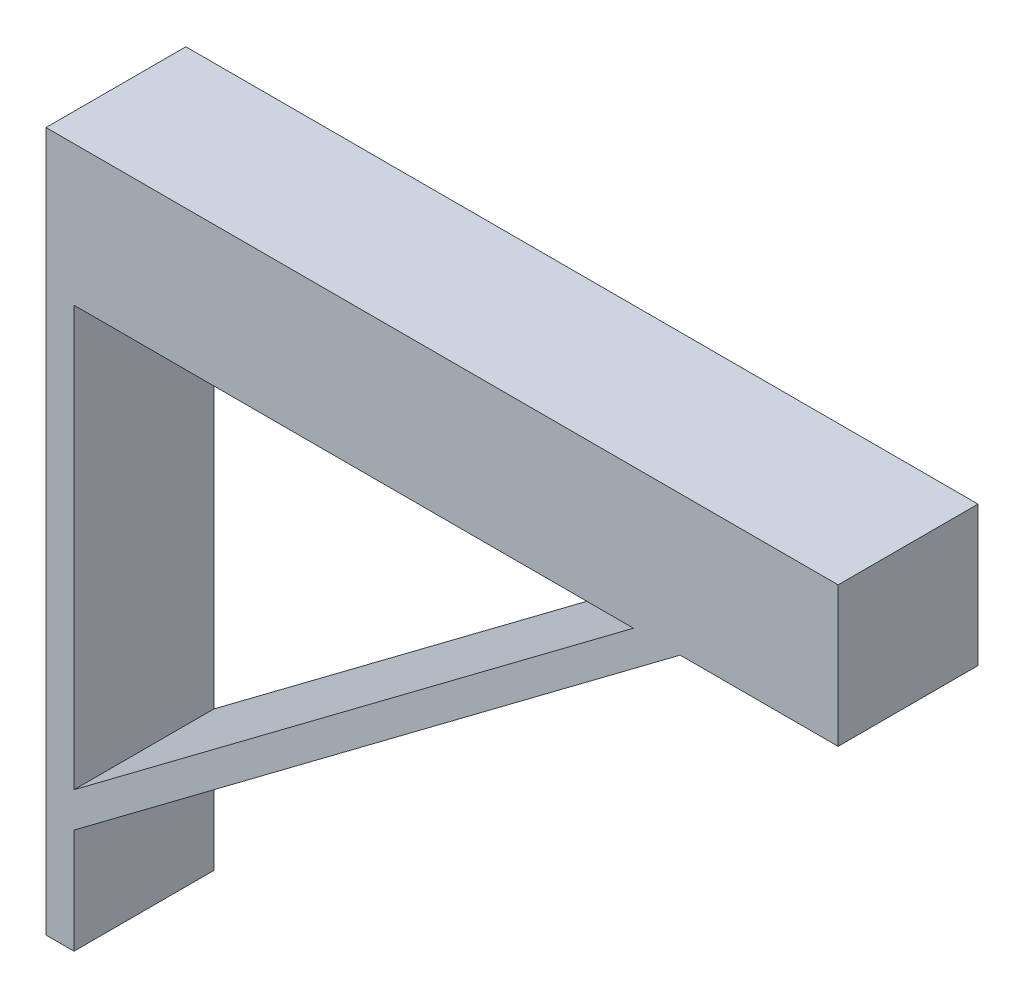
ISO-10303-21;
HEADER;
FILE_DESCRIPTION(('STEP AP214'),'2;1');
FILE_NAME('part.step','',(''),(''),'','','');
FILE_SCHEMA(('AUTOMOTIVE_DESIGN { 1 0 10303 214 1 1 1 1 }'));
ENDSEC;
DATA;
#1=APPLICATION_CONTEXT('core data for automotive mechanical design processes');
#2=APPLICATION_PROTOCOL_DEFINITION('international standard','automotive_design',2000,#1);
#3=PRODUCT_CONTEXT('',#1,'mechanical');
#4=PRODUCT('Part','Part','',(#3));
#5=PRODUCT_RELATED_PRODUCT_CATEGORY('part','',(#4));
#6=PRODUCT_DEFINITION_FORMATION('','',#4);
#7=PRODUCT_DEFINITION_CONTEXT('part definition',#1,'design');
#8=PRODUCT_DEFINITION('design','',#6,#7);
#9=PRODUCT_DEFINITION_SHAPE('','',#8);
#10=(LENGTH_UNIT() NAMED_UNIT(*) SI_UNIT(.MILLI.,.METRE.));
#11=(NAMED_UNIT(*) PLANE_ANGLE_UNIT() SI_UNIT($,.RADIAN.));
#12=(NAMED_UNIT(*) SI_UNIT($,.STERADIAN.) SOLID_ANGLE_UNIT());
#13=UNCERTAINTY_MEASURE_WITH_UNIT(LENGTH_MEASURE(1.E-05),#10,'distance_accuracy_value','');
#14=(GEOMETRIC_REPRESENTATION_CONTEXT(3) GLOBAL_UNCERTAINTY_ASSIGNED_CONTEXT((#13)) GLOBAL_UNIT_ASSIGNED_CONTEXT((#10,
#11,#12)) REPRESENTATION_CONTEXT('',''));
#15=CARTESIAN_POINT('',(0.,0.,0.));
#16=DIRECTION('',(0.,0.,1.));
#17=DIRECTION('',(1.,0.,0.));
#18=AXIS2_PLACEMENT_3D('',#15,#16,#17);
#19=CARTESIAN_POINT('',(8.88791208791208,-11.8505494505494,20.));
#20=DIRECTION('',(0.6,-0.8,0.));
#21=DIRECTION('',(0.8,0.6,0.));
#22=AXIS2_PLACEMENT_3D('',#19,#20,#21);
#23=PLANE('',#22);
#24=DIRECTION('',(-0.8,-0.6,0.));
#25=VECTOR('',#24,1.);
#26=CARTESIAN_POINT('',(8.88791208791208,-11.8505494505494,0.));
#27=LINE('',#26,#25);
#28=CARTESIAN_POINT('',(42.7106227106227,13.5164835164835,0.));
#29=VERTEX_POINT('',#28);
#30=CARTESIAN_POINT('',(-43.956043956044,-51.4835164835165,0.));
#31=VERTEX_POINT('',#30);
#32=EDGE_CURVE('E177',#29,#31,#27,.T.);
#33=ORIENTED_EDGE('',*,*,#32,.F.);
#34=DIRECTION('',(0.,0.,-1.));
#35=VECTOR('',#34,1.);
#36=CARTESIAN_POINT('',(42.7106227106227,13.5164835164835,20.));
#37=LINE('',#36,#35);
#38=CARTESIAN_POINT('',(42.7106227106227,13.5164835164835,20.));
#39=VERTEX_POINT('',#38);
#40=EDGE_CURVE('E11',#39,#29,#37,.T.);
#41=ORIENTED_EDGE('',*,*,#40,.F.);
#42=DIRECTION('',(-0.8,-0.6,0.));
#43=VECTOR('',#42,1.);
#44=CARTESIAN_POINT('',(8.88791208791208,-11.8505494505494,20.));
#45=LINE('',#44,#43);
#46=CARTESIAN_POINT('',(-43.956043956044,-51.4835164835165,20.));
#47=VERTEX_POINT('',#46);
#48=EDGE_CURVE('E194',#39,#47,#45,.T.);
#49=ORIENTED_EDGE('',*,*,#48,.T.);
#50=DIRECTION('',(0.,0.,-1.));
#51=VECTOR('',#50,1.);
#52=CARTESIAN_POINT('',(-43.956043956044,-51.4835164835165,20.));
#53=LINE('',#52,#51);
#54=EDGE_CURVE('E54',#47,#31,#53,.T.);
#55=ORIENTED_EDGE('',*,*,#54,.T.);
#56=EDGE_LOOP('',(#33,#41,#49,#55));
#57=FACE_BOUND('',#56,.T.);
#58=ADVANCED_FACE('F35',(#57),#23,.T.);
#59=CARTESIAN_POINT('',(0.,13.5164835164835,20.));
#60=DIRECTION('',(0.,1.,0.));
#61=DIRECTION('',(-1.,0.,0.));
#62=AXIS2_PLACEMENT_3D('',#59,#60,#61);
#63=PLANE('',#62);
#64=DIRECTION('',(1.,0.,0.));
#65=VECTOR('',#64,1.);
#66=CARTESIAN_POINT('',(0.,13.5164835164835,0.));
#67=LINE('',#66,#65);
#68=CARTESIAN_POINT('',(65.3039560439561,13.5164835164835,0.));
#69=VERTEX_POINT('',#68);
#70=EDGE_CURVE('E174',#29,#69,#67,.T.);
#71=ORIENTED_EDGE('',*,*,#70,.T.);
#72=DIRECTION('',(0.,0.,-1.));
#73=VECTOR('',#72,1.);
#74=CARTESIAN_POINT('',(65.3039560439561,13.5164835164835,20.));
#75=LINE('',#74,#73);
#76=CARTESIAN_POINT('',(65.3039560439561,13.5164835164835,20.));
#77=VERTEX_POINT('',#76);
#78=EDGE_CURVE('E45',#77,#69,#75,.T.);
#79=ORIENTED_EDGE('',*,*,#78,.F.);
#80=DIRECTION('',(1.,0.,0.));
#81=VECTOR('',#80,1.);
#82=CARTESIAN_POINT('',(0.,13.5164835164835,20.));
#83=LINE('',#82,#81);
#84=EDGE_CURVE('E192',#39,#77,#83,.T.);
#85=ORIENTED_EDGE('',*,*,#84,.F.);
#86=ORIENTED_EDGE('',*,*,#40,.T.);
#87=EDGE_LOOP('',(#71,#79,#85,#86));
#88=FACE_BOUND('',#87,.T.);
#89=ADVANCED_FACE('F216',(#88),#63,.F.);
#90=CARTESIAN_POINT('',(65.3039560439561,0.,20.));
#91=DIRECTION('',(1.,0.,0.));
#92=DIRECTION('',(0.,1.,0.));
#93=AXIS2_PLACEMENT_3D('',#90,#91,#92);
#94=PLANE('',#93);
#95=DIRECTION('',(0.,-1.,0.));
#96=VECTOR('',#95,1.);
#97=CARTESIAN_POINT('',(65.3039560439561,0.,0.));
#98=LINE('',#97,#96);
#99=CARTESIAN_POINT('',(65.303956043956,33.5164835164835,0.));
#100=VERTEX_POINT('',#99);
#101=EDGE_CURVE('E171',#100,#69,#98,.T.);
#102=ORIENTED_EDGE('',*,*,#101,.F.);
#103=DIRECTION('',(0.,0.,-1.));
#104=VECTOR('',#103,1.);
#105=CARTESIAN_POINT('',(65.303956043956,33.5164835164835,20.));
#106=LINE('',#105,#104);
#107=CARTESIAN_POINT('',(65.303956043956,33.5164835164835,20.));
#108=VERTEX_POINT('',#107);
#109=EDGE_CURVE('E144',#108,#100,#106,.T.);
#110=ORIENTED_EDGE('',*,*,#109,.F.);
#111=DIRECTION('',(0.,-1.,0.));
#112=VECTOR('',#111,1.);
#113=CARTESIAN_POINT('',(65.3039560439561,0.,20.));
#114=LINE('',#113,#112);
#115=EDGE_CURVE('E189',#108,#77,#114,.T.);
#116=ORIENTED_EDGE('',*,*,#115,.T.);
#117=ORIENTED_EDGE('',*,*,#78,.T.);
#118=EDGE_LOOP('',(#102,#110,#116,#117));
#119=FACE_BOUND('',#118,.T.);
#120=ADVANCED_FACE('F221',(#119),#94,.T.);
#121=CARTESIAN_POINT('',(0.,33.5164835164835,20.));
#122=DIRECTION('',(0.,1.,0.));
#123=DIRECTION('',(0.,0.,1.));
#124=AXIS2_PLACEMENT_3D('',#121,#122,#123);
#125=PLANE('',#124);
#126=DIRECTION('',(1.,0.,0.));
#127=VECTOR('',#126,1.);
#128=CARTESIAN_POINT('',(0.,33.5164835164835,0.));
#129=LINE('',#128,#127);
#130=CARTESIAN_POINT('',(-47.956043956044,33.5164835164835,0.));
#131=VERTEX_POINT('',#130);
#132=EDGE_CURVE('E168',#131,#100,#129,.T.);
#133=ORIENTED_EDGE('',*,*,#132,.F.);
#134=DIRECTION('',(0.,0.,-1.));
#135=VECTOR('',#134,1.);
#136=CARTESIAN_POINT('',(-47.956043956044,33.5164835164835,20.));
#137=LINE('',#136,#135);
#138=CARTESIAN_POINT('',(-47.956043956044,33.5164835164835,20.));
#139=VERTEX_POINT('',#138);
#140=EDGE_CURVE('E142',#139,#131,#137,.T.);
#141=ORIENTED_EDGE('',*,*,#140,.F.);
#142=DIRECTION('',(1.,0.,0.));
#143=VECTOR('',#142,1.);
#144=CARTESIAN_POINT('',(0.,33.5164835164835,20.));
#145=LINE('',#144,#143);
#146=EDGE_CURVE('E136',#139,#108,#145,.T.);
#147=ORIENTED_EDGE('',*,*,#146,.T.);
#148=ORIENTED_EDGE('',*,*,#109,.T.);
#149=EDGE_LOOP('',(#133,#141,#147,#148));
#150=FACE_BOUND('',#149,.T.);
#151=ADVANCED_FACE('F227',(#150),#125,.T.);
#152=CARTESIAN_POINT('',(-47.956043956044,0.,20.));
#153=DIRECTION('',(1.,0.,0.));
#154=DIRECTION('',(0.,1.,0.));
#155=AXIS2_PLACEMENT_3D('',#152,#153,#154);
#156=PLANE('',#155);
#157=DIRECTION('',(0.,-1.,0.));
#158=VECTOR('',#157,1.);
#159=CARTESIAN_POINT('',(-47.956043956044,0.,0.));
#160=LINE('',#159,#158);
#161=CARTESIAN_POINT('',(-47.956043956044,-66.4835164835165,0.));
#162=VERTEX_POINT('',#161);
#163=EDGE_CURVE('E141',#131,#162,#160,.T.);
#164=ORIENTED_EDGE('',*,*,#163,.T.);
#165=DIRECTION('',(0.,0.,-1.));
#166=VECTOR('',#165,1.);
#167=CARTESIAN_POINT('',(-47.956043956044,-66.4835164835165,20.));
#168=LINE('',#167,#166);
#169=CARTESIAN_POINT('',(-47.956043956044,-66.4835164835165,20.));
#170=VERTEX_POINT('',#169);
#171=EDGE_CURVE('E123',#170,#162,#168,.T.);
#172=ORIENTED_EDGE('',*,*,#171,.F.);
#173=DIRECTION('',(0.,-1.,0.));
#174=VECTOR('',#173,1.);
#175=CARTESIAN_POINT('',(-47.956043956044,0.,20.));
#176=LINE('',#175,#174);
#177=EDGE_CURVE('E128',#139,#170,#176,.T.);
#178=ORIENTED_EDGE('',*,*,#177,.F.);
#179=ORIENTED_EDGE('',*,*,#140,.T.);
#180=EDGE_LOOP('',(#164,#172,#178,#179));
#181=FACE_BOUND('',#180,.T.);
#182=ADVANCED_FACE('F139',(#181),#156,.F.);
#183=CARTESIAN_POINT('',(-2.30661033618894E-13,-66.4835164835167,20.));
#184=DIRECTION('',(0.,1.,0.));
#185=DIRECTION('',(-1.,0.,0.));
#186=AXIS2_PLACEMENT_3D('',#183,#184,#185);
#187=PLANE('',#186);
#188=DIRECTION('',(1.,0.,0.));
#189=VECTOR('',#188,1.);
#190=CARTESIAN_POINT('',(-2.30661033618894E-13,-66.4835164835167,0.));
#191=LINE('',#190,#189);
#192=CARTESIAN_POINT('',(-43.956043956044,-66.4835164835165,0.));
#193=VERTEX_POINT('',#192);
#194=EDGE_CURVE('E165',#162,#193,#191,.T.);
#195=ORIENTED_EDGE('',*,*,#194,.T.);
#196=DIRECTION('',(0.,0.,-1.));
#197=VECTOR('',#196,1.);
#198=CARTESIAN_POINT('',(-43.956043956044,-66.4835164835165,20.));
#199=LINE('',#198,#197);
#200=CARTESIAN_POINT('',(-43.956043956044,-66.4835164835165,20.));
#201=VERTEX_POINT('',#200);
#202=EDGE_CURVE('E86',#201,#193,#199,.T.);
#203=ORIENTED_EDGE('',*,*,#202,.F.);
#204=DIRECTION('',(1.,0.,0.));
#205=VECTOR('',#204,1.);
#206=CARTESIAN_POINT('',(-2.30661033618894E-13,-66.4835164835167,20.));
#207=LINE('',#206,#205);
#208=EDGE_CURVE('E119',#170,#201,#207,.T.);
#209=ORIENTED_EDGE('',*,*,#208,.F.);
#210=ORIENTED_EDGE('',*,*,#171,.T.);
#211=EDGE_LOOP('',(#195,#203,#209,#210));
#212=FACE_BOUND('',#211,.T.);
#213=ADVANCED_FACE('F121',(#212),#187,.F.);
#214=CARTESIAN_POINT('',(-43.956043956044,0.,20.));
#215=DIRECTION('',(1.,0.,0.));
#216=DIRECTION('',(0.,0.,-1.));
#217=AXIS2_PLACEMENT_3D('',#214,#215,#216);
#218=PLANE('',#217);
#219=DIRECTION('',(0.,-1.,0.));
#220=VECTOR('',#219,1.);
#221=CARTESIAN_POINT('',(-43.956043956044,0.,0.));
#222=LINE('',#221,#220);
#223=CARTESIAN_POINT('',(-43.956043956044,13.5164835164835,0.));
#224=VERTEX_POINT('',#223);
#225=CARTESIAN_POINT('',(-43.956043956044,-46.4835164835165,0.));
#226=VERTEX_POINT('',#225);
#227=EDGE_CURVE('E184',#224,#226,#222,.T.);
#228=ORIENTED_EDGE('',*,*,#227,.F.);
#229=DIRECTION('',(0.,0.,-1.));
#230=VECTOR('',#229,1.);
#231=CARTESIAN_POINT('',(-43.956043956044,13.5164835164835,20.));
#232=LINE('',#231,#230);
#233=CARTESIAN_POINT('',(-43.956043956044,13.5164835164835,20.));
#234=VERTEX_POINT('',#233);
#235=EDGE_CURVE('E39',#234,#224,#232,.T.);
#236=ORIENTED_EDGE('',*,*,#235,.F.);
#237=DIRECTION('',(0.,-1.,0.));
#238=VECTOR('',#237,1.);
#239=CARTESIAN_POINT('',(-43.956043956044,0.,20.));
#240=LINE('',#239,#238);
#241=CARTESIAN_POINT('',(-43.956043956044,-46.4835164835165,20.));
#242=VERTEX_POINT('',#241);
#243=EDGE_CURVE('E164',#234,#242,#240,.T.);
#244=ORIENTED_EDGE('',*,*,#243,.T.);
#245=DIRECTION('',(0.,0.,-1.));
#246=VECTOR('',#245,1.);
#247=CARTESIAN_POINT('',(-43.956043956044,-46.4835164835165,20.));
#248=LINE('',#247,#246);
#249=EDGE_CURVE('E151',#242,#226,#248,.T.);
#250=ORIENTED_EDGE('',*,*,#249,.T.);
#251=EDGE_LOOP('',(#228,#236,#244,#250));
#252=FACE_BOUND('',#251,.T.);
#253=ADVANCED_FACE('F37',(#252),#218,.T.);
#254=CARTESIAN_POINT('',(0.,13.5164835164835,20.));
#255=DIRECTION('',(0.,1.,0.));
#256=DIRECTION('',(0.,0.,1.));
#257=AXIS2_PLACEMENT_3D('',#254,#255,#256);
#258=PLANE('',#257);
#259=DIRECTION('',(1.,0.,0.));
#260=VECTOR('',#259,1.);
#261=CARTESIAN_POINT('',(0.,13.5164835164835,0.));
#262=LINE('',#261,#260);
#263=CARTESIAN_POINT('',(36.043956043956,13.5164835164835,0.));
#264=VERTEX_POINT('',#263);
#265=EDGE_CURVE('E182',#224,#264,#262,.T.);
#266=ORIENTED_EDGE('',*,*,#265,.T.);
#267=DIRECTION('',(0.,0.,-1.));
#268=VECTOR('',#267,1.);
#269=CARTESIAN_POINT('',(36.043956043956,13.5164835164835,20.));
#270=LINE('',#269,#268);
#271=CARTESIAN_POINT('',(36.043956043956,13.5164835164835,20.));
#272=VERTEX_POINT('',#271);
#273=EDGE_CURVE('E152',#272,#264,#270,.T.);
#274=ORIENTED_EDGE('',*,*,#273,.F.);
#275=DIRECTION('',(1.,0.,0.));
#276=VECTOR('',#275,1.);
#277=CARTESIAN_POINT('',(0.,13.5164835164835,20.));
#278=LINE('',#277,#276);
#279=EDGE_CURVE('E198',#234,#272,#278,.T.);
#280=ORIENTED_EDGE('',*,*,#279,.F.);
#281=ORIENTED_EDGE('',*,*,#235,.T.);
#282=EDGE_LOOP('',(#266,#274,#280,#281));
#283=FACE_BOUND('',#282,.T.);
#284=ADVANCED_FACE('F207',(#283),#258,.F.);
#285=CARTESIAN_POINT('',(6.48791208791208,-8.65054945054943,20.));
#286=DIRECTION('',(-0.6,0.8,0.));
#287=DIRECTION('',(-0.8,-0.6,0.));
#288=AXIS2_PLACEMENT_3D('',#285,#286,#287);
#289=PLANE('',#288);
#290=DIRECTION('',(0.8,0.6,0.));
#291=VECTOR('',#290,1.);
#292=CARTESIAN_POINT('',(6.48791208791208,-8.65054945054943,0.));
#293=LINE('',#292,#291);
#294=EDGE_CURVE('E179',#226,#264,#293,.T.);
#295=ORIENTED_EDGE('',*,*,#294,.F.);
#296=ORIENTED_EDGE('',*,*,#249,.F.);
#297=DIRECTION('',(0.8,0.6,0.));
#298=VECTOR('',#297,1.);
#299=CARTESIAN_POINT('',(6.48791208791208,-8.65054945054943,20.));
#300=LINE('',#299,#298);
#301=EDGE_CURVE('E196',#242,#272,#300,.T.);
#302=ORIENTED_EDGE('',*,*,#301,.T.);
#303=ORIENTED_EDGE('',*,*,#273,.T.);
#304=EDGE_LOOP('',(#295,#296,#302,#303));
#305=FACE_BOUND('',#304,.T.);
#306=ADVANCED_FACE('F203',(#305),#289,.T.);
#307=CARTESIAN_POINT('',(-43.9560439560439,0.,20.));
#308=DIRECTION('',(1.,0.,0.));
#309=DIRECTION('',(0.,1.,0.));
#310=AXIS2_PLACEMENT_3D('',#307,#308,#309);
#311=PLANE('',#310);
#312=DIRECTION('',(0.,-1.,0.));
#313=VECTOR('',#312,1.);
#314=CARTESIAN_POINT('',(-43.9560439560439,0.,0.));
#315=LINE('',#314,#313);
#316=EDGE_CURVE('E161',#31,#193,#315,.T.);
#317=ORIENTED_EDGE('',*,*,#316,.F.);
#318=ORIENTED_EDGE('',*,*,#54,.F.);
#319=DIRECTION('',(0.,-1.,0.));
#320=VECTOR('',#319,1.);
#321=CARTESIAN_POINT('',(-43.9560439560439,0.,20.));
#322=LINE('',#321,#320);
#323=EDGE_CURVE('E127',#47,#201,#322,.T.);
#324=ORIENTED_EDGE('',*,*,#323,.T.);
#325=ORIENTED_EDGE('',*,*,#202,.T.);
#326=EDGE_LOOP('',(#317,#318,#324,#325));
#327=FACE_BOUND('',#326,.T.);
#328=ADVANCED_FACE('F213',(#327),#311,.T.);
#329=CARTESIAN_POINT('',(0.,0.,20.));
#330=DIRECTION('',(0.,0.,1.));
#331=DIRECTION('',(1.,0.,0.));
#332=AXIS2_PLACEMENT_3D('',#329,#330,#331);
#333=PLANE('',#332);
#334=ORIENTED_EDGE('',*,*,#243,.F.);
#335=ORIENTED_EDGE('',*,*,#279,.T.);
#336=ORIENTED_EDGE('',*,*,#301,.F.);
#337=EDGE_LOOP('',(#334,#335,#336));
#338=FACE_BOUND('',#337,.T.);
#339=ORIENTED_EDGE('',*,*,#48,.F.);
#340=ORIENTED_EDGE('',*,*,#84,.T.);
#341=ORIENTED_EDGE('',*,*,#115,.F.);
#342=ORIENTED_EDGE('',*,*,#146,.F.);
#343=ORIENTED_EDGE('',*,*,#177,.T.);
#344=ORIENTED_EDGE('',*,*,#208,.T.);
#345=ORIENTED_EDGE('',*,*,#323,.F.);
#346=EDGE_LOOP('',(#339,#340,#341,#342,#343,#344,#345));
#347=FACE_BOUND('',#346,.T.);
#348=ADVANCED_FACE('F133',(#338,#347),#333,.T.);
#349=CARTESIAN_POINT('',(0.,0.,0.));
#350=DIRECTION('',(0.,0.,1.));
#351=DIRECTION('',(1.,0.,0.));
#352=AXIS2_PLACEMENT_3D('',#349,#350,#351);
#353=PLANE('',#352);
#354=ORIENTED_EDGE('',*,*,#227,.T.);
#355=ORIENTED_EDGE('',*,*,#294,.T.);
#356=ORIENTED_EDGE('',*,*,#265,.F.);
#357=EDGE_LOOP('',(#354,#355,#356));
#358=FACE_BOUND('',#357,.T.);
#359=ORIENTED_EDGE('',*,*,#32,.T.);
#360=ORIENTED_EDGE('',*,*,#316,.T.);
#361=ORIENTED_EDGE('',*,*,#194,.F.);
#362=ORIENTED_EDGE('',*,*,#163,.F.);
#363=ORIENTED_EDGE('',*,*,#132,.T.);
#364=ORIENTED_EDGE('',*,*,#101,.T.);
#365=ORIENTED_EDGE('',*,*,#70,.F.);
#366=EDGE_LOOP('',(#359,#360,#361,#362,#363,#364,#365));
#367=FACE_BOUND('',#366,.T.);
#368=ADVANCED_FACE('F205',(#358,#367),#353,.F.);
#369=CLOSED_SHELL('',(#58,#89,#120,#151,#182,#213,#253,#284,#306,#328,#348,#368));
#370=MANIFOLD_SOLID_BREP('B2',#369);
#371=ADVANCED_BREP_SHAPE_REPRESENTATION('',(#18,#370),#14);
#372=SHAPE_DEFINITION_REPRESENTATION(#9,#371);
ENDSEC;
END-ISO-10303-21;
